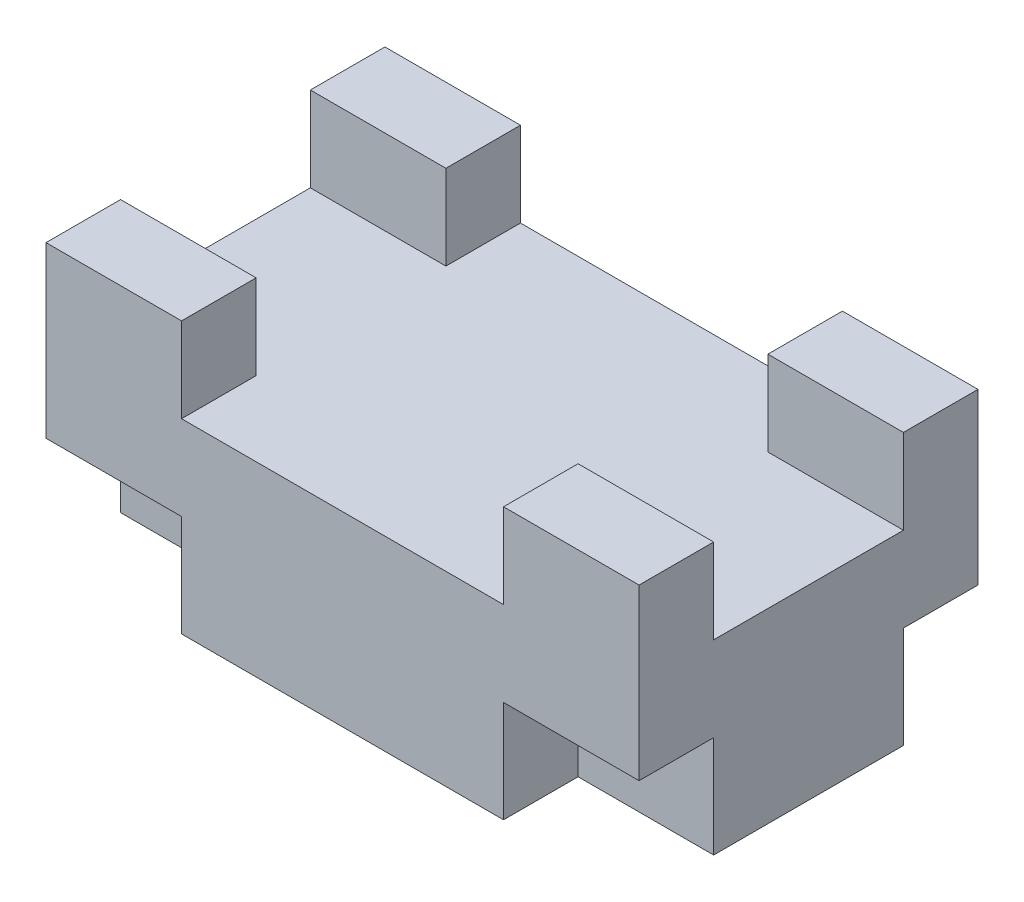
ISO-10303-21;
HEADER;
FILE_DESCRIPTION(('STEP AP214'),'2;1');
FILE_NAME('part.step','',(''),(''),'','','');
FILE_SCHEMA(('AUTOMOTIVE_DESIGN { 1 0 10303 214 1 1 1 1 }'));
ENDSEC;
DATA;
#1=APPLICATION_CONTEXT('core data for automotive mechanical design processes');
#2=APPLICATION_PROTOCOL_DEFINITION('international standard','automotive_design',2000,#1);
#3=PRODUCT_CONTEXT('',#1,'mechanical');
#4=PRODUCT('Part','Part','',(#3));
#5=PRODUCT_RELATED_PRODUCT_CATEGORY('part','',(#4));
#6=PRODUCT_DEFINITION_FORMATION('','',#4);
#7=PRODUCT_DEFINITION_CONTEXT('part definition',#1,'design');
#8=PRODUCT_DEFINITION('design','',#6,#7);
#9=PRODUCT_DEFINITION_SHAPE('','',#8);
#10=(LENGTH_UNIT() NAMED_UNIT(*) SI_UNIT(.MILLI.,.METRE.));
#11=(NAMED_UNIT(*) PLANE_ANGLE_UNIT() SI_UNIT($,.RADIAN.));
#12=(NAMED_UNIT(*) SI_UNIT($,.STERADIAN.) SOLID_ANGLE_UNIT());
#13=UNCERTAINTY_MEASURE_WITH_UNIT(LENGTH_MEASURE(1.E-05),#10,'distance_accuracy_value','');
#14=(GEOMETRIC_REPRESENTATION_CONTEXT(3) GLOBAL_UNCERTAINTY_ASSIGNED_CONTEXT((#13)) GLOBAL_UNIT_ASSIGNED_CONTEXT((#10,
#11,#12)) REPRESENTATION_CONTEXT('',''));
#15=CARTESIAN_POINT('',(0.,0.,0.));
#16=DIRECTION('',(0.,0.,1.));
#17=DIRECTION('',(1.,0.,0.));
#18=AXIS2_PLACEMENT_3D('',#15,#16,#17);
#19=CARTESIAN_POINT('',(0.,55.,0.));
#20=DIRECTION('',(0.,-1.,0.));
#21=DIRECTION('',(0.,0.,-1.));
#22=AXIS2_PLACEMENT_3D('',#19,#20,#21);
#23=PLANE('',#22);
#24=DIRECTION('',(-1.,0.,0.));
#25=VECTOR('',#24,1.);
#26=CARTESIAN_POINT('',(0.,55.,28.));
#27=LINE('',#26,#25);
#28=CARTESIAN_POINT('',(87.5,55.,28.));
#29=VERTEX_POINT('',#28);
#30=CARTESIAN_POINT('',(47.5,55.,28.));
#31=VERTEX_POINT('',#30);
#32=EDGE_CURVE('E61',#29,#31,#27,.T.);
#33=ORIENTED_EDGE('',*,*,#32,.F.);
#34=DIRECTION('',(0.,0.,1.));
#35=VECTOR('',#34,1.);
#36=CARTESIAN_POINT('',(87.5,55.,0.));
#37=LINE('',#36,#35);
#38=CARTESIAN_POINT('',(87.5,55.,-28.));
#39=VERTEX_POINT('',#38);
#40=EDGE_CURVE('E376',#39,#29,#37,.T.);
#41=ORIENTED_EDGE('',*,*,#40,.F.);
#42=DIRECTION('',(-1.,0.,0.));
#43=VECTOR('',#42,1.);
#44=CARTESIAN_POINT('',(0.,55.,-28.));
#45=LINE('',#44,#43);
#46=CARTESIAN_POINT('',(47.5,55.,-28.));
#47=VERTEX_POINT('',#46);
#48=EDGE_CURVE('E278',#39,#47,#45,.T.);
#49=ORIENTED_EDGE('',*,*,#48,.T.);
#50=DIRECTION('',(0.,0.,1.));
#51=VECTOR('',#50,1.);
#52=CARTESIAN_POINT('',(47.5,55.,0.));
#53=LINE('',#52,#51);
#54=CARTESIAN_POINT('',(47.5,55.,-50.));
#55=VERTEX_POINT('',#54);
#56=EDGE_CURVE('E290',#55,#47,#53,.T.);
#57=ORIENTED_EDGE('',*,*,#56,.F.);
#58=DIRECTION('',(-1.,0.,0.));
#59=VECTOR('',#58,1.);
#60=CARTESIAN_POINT('',(0.,55.,-50.));
#61=LINE('',#60,#59);
#62=CARTESIAN_POINT('',(-47.5,55.,-50.));
#63=VERTEX_POINT('',#62);
#64=EDGE_CURVE('E380',#55,#63,#61,.T.);
#65=ORIENTED_EDGE('',*,*,#64,.T.);
#66=DIRECTION('',(0.,0.,1.));
#67=VECTOR('',#66,1.);
#68=CARTESIAN_POINT('',(-47.5,55.,0.));
#69=LINE('',#68,#67);
#70=CARTESIAN_POINT('',(-47.5,55.,-28.));
#71=VERTEX_POINT('',#70);
#72=EDGE_CURVE('E243',#63,#71,#69,.T.);
#73=ORIENTED_EDGE('',*,*,#72,.T.);
#74=DIRECTION('',(1.,0.,0.));
#75=VECTOR('',#74,1.);
#76=CARTESIAN_POINT('',(0.,55.,-28.));
#77=LINE('',#76,#75);
#78=CARTESIAN_POINT('',(-87.5,55.,-28.));
#79=VERTEX_POINT('',#78);
#80=EDGE_CURVE('E69',#79,#71,#77,.T.);
#81=ORIENTED_EDGE('',*,*,#80,.F.);
#82=DIRECTION('',(0.,0.,1.));
#83=VECTOR('',#82,1.);
#84=CARTESIAN_POINT('',(-87.5,55.,0.));
#85=LINE('',#84,#83);
#86=CARTESIAN_POINT('',(-87.5,55.,28.));
#87=VERTEX_POINT('',#86);
#88=EDGE_CURVE('E368',#79,#87,#85,.T.);
#89=ORIENTED_EDGE('',*,*,#88,.T.);
#90=DIRECTION('',(1.,0.,0.));
#91=VECTOR('',#90,1.);
#92=CARTESIAN_POINT('',(0.,55.,28.));
#93=LINE('',#92,#91);
#94=CARTESIAN_POINT('',(-47.5,55.,28.));
#95=VERTEX_POINT('',#94);
#96=EDGE_CURVE('E251',#87,#95,#93,.T.);
#97=ORIENTED_EDGE('',*,*,#96,.T.);
#98=DIRECTION('',(0.,0.,-1.));
#99=VECTOR('',#98,1.);
#100=CARTESIAN_POINT('',(-47.5,55.,0.));
#101=LINE('',#100,#99);
#102=CARTESIAN_POINT('',(-47.5,55.,50.));
#103=VERTEX_POINT('',#102);
#104=EDGE_CURVE('E340',#103,#95,#101,.T.);
#105=ORIENTED_EDGE('',*,*,#104,.F.);
#106=DIRECTION('',(-1.,0.,0.));
#107=VECTOR('',#106,1.);
#108=CARTESIAN_POINT('',(0.,55.,50.));
#109=LINE('',#108,#107);
#110=CARTESIAN_POINT('',(47.5,55.,50.));
#111=VERTEX_POINT('',#110);
#112=EDGE_CURVE('E371',#111,#103,#109,.T.);
#113=ORIENTED_EDGE('',*,*,#112,.F.);
#114=DIRECTION('',(0.,0.,-1.));
#115=VECTOR('',#114,1.);
#116=CARTESIAN_POINT('',(47.5,55.,0.));
#117=LINE('',#116,#115);
#118=EDGE_CURVE('E311',#111,#31,#117,.T.);
#119=ORIENTED_EDGE('',*,*,#118,.T.);
#120=EDGE_LOOP('',(#33,#41,#49,#57,#65,#73,#81,#89,#97,#105,#113,#119));
#121=FACE_BOUND('',#120,.T.);
#122=ADVANCED_FACE('F45',(#121),#23,.F.);
#123=CARTESIAN_POINT('',(0.,30.,50.));
#124=DIRECTION('',(0.,0.,-1.));
#125=DIRECTION('',(-1.,0.,0.));
#126=AXIS2_PLACEMENT_3D('',#123,#124,#125);
#127=PLANE('',#126);
#128=DIRECTION('',(1.,0.,0.));
#129=VECTOR('',#128,1.);
#130=CARTESIAN_POINT('',(0.,0.,50.));
#131=LINE('',#130,#129);
#132=CARTESIAN_POINT('',(-47.5,0.,50.));
#133=VERTEX_POINT('',#132);
#134=CARTESIAN_POINT('',(47.5,0.,50.));
#135=VERTEX_POINT('',#134);
#136=EDGE_CURVE('E415',#133,#135,#131,.T.);
#137=ORIENTED_EDGE('',*,*,#136,.T.);
#138=DIRECTION('',(0.,-1.,0.));
#139=VECTOR('',#138,1.);
#140=CARTESIAN_POINT('',(47.5,30.,50.));
#141=LINE('',#140,#139);
#142=CARTESIAN_POINT('',(47.5,30.,50.));
#143=VERTEX_POINT('',#142);
#144=EDGE_CURVE('E11',#143,#135,#141,.T.);
#145=ORIENTED_EDGE('',*,*,#144,.F.);
#146=DIRECTION('',(-1.,0.,0.));
#147=VECTOR('',#146,1.);
#148=CARTESIAN_POINT('',(0.,30.,50.));
#149=LINE('',#148,#147);
#150=CARTESIAN_POINT('',(87.5,30.,50.));
#151=VERTEX_POINT('',#150);
#152=EDGE_CURVE('E390',#151,#143,#149,.T.);
#153=ORIENTED_EDGE('',*,*,#152,.F.);
#154=DIRECTION('',(0.,-1.,0.));
#155=VECTOR('',#154,1.);
#156=CARTESIAN_POINT('',(87.5,55.,50.));
#157=LINE('',#156,#155);
#158=CARTESIAN_POINT('',(87.5,80.,50.));
#159=VERTEX_POINT('',#158);
#160=EDGE_CURVE('E407',#159,#151,#157,.T.);
#161=ORIENTED_EDGE('',*,*,#160,.F.);
#162=DIRECTION('',(1.,0.,0.));
#163=VECTOR('',#162,1.);
#164=CARTESIAN_POINT('',(0.,80.,50.));
#165=LINE('',#164,#163);
#166=CARTESIAN_POINT('',(47.5,80.,50.));
#167=VERTEX_POINT('',#166);
#168=EDGE_CURVE('E315',#167,#159,#165,.T.);
#169=ORIENTED_EDGE('',*,*,#168,.F.);
#170=DIRECTION('',(0.,-1.,0.));
#171=VECTOR('',#170,1.);
#172=CARTESIAN_POINT('',(47.5,80.,50.));
#173=LINE('',#172,#171);
#174=EDGE_CURVE('E330',#167,#111,#173,.T.);
#175=ORIENTED_EDGE('',*,*,#174,.T.);
#176=ORIENTED_EDGE('',*,*,#112,.T.);
#177=DIRECTION('',(0.,-1.,0.));
#178=VECTOR('',#177,1.);
#179=CARTESIAN_POINT('',(-47.5,80.,50.));
#180=LINE('',#179,#178);
#181=CARTESIAN_POINT('',(-47.5,80.,50.));
#182=VERTEX_POINT('',#181);
#183=EDGE_CURVE('E356',#182,#103,#180,.T.);
#184=ORIENTED_EDGE('',*,*,#183,.F.);
#185=DIRECTION('',(1.,0.,0.));
#186=VECTOR('',#185,1.);
#187=CARTESIAN_POINT('',(0.,80.,50.));
#188=LINE('',#187,#186);
#189=CARTESIAN_POINT('',(-87.5,80.,50.));
#190=VERTEX_POINT('',#189);
#191=EDGE_CURVE('E347',#190,#182,#188,.T.);
#192=ORIENTED_EDGE('',*,*,#191,.F.);
#193=DIRECTION('',(0.,-1.,0.));
#194=VECTOR('',#193,1.);
#195=CARTESIAN_POINT('',(-87.5,55.,50.));
#196=LINE('',#195,#194);
#197=CARTESIAN_POINT('',(-87.5,30.,50.));
#198=VERTEX_POINT('',#197);
#199=EDGE_CURVE('E411',#190,#198,#196,.T.);
#200=ORIENTED_EDGE('',*,*,#199,.T.);
#201=CARTESIAN_POINT('',(-47.5,30.,50.));
#202=VERTEX_POINT('',#201);
#203=EDGE_CURVE('E389',#202,#198,#149,.T.);
#204=ORIENTED_EDGE('',*,*,#203,.F.);
#205=DIRECTION('',(0.,-1.,0.));
#206=VECTOR('',#205,1.);
#207=CARTESIAN_POINT('',(-47.5,30.,50.));
#208=LINE('',#207,#206);
#209=EDGE_CURVE('E445',#202,#133,#208,.T.);
#210=ORIENTED_EDGE('',*,*,#209,.T.);
#211=EDGE_LOOP('',(#137,#145,#153,#161,#169,#175,#176,#184,#192,#200,#204,#210));
#212=FACE_BOUND('',#211,.T.);
#213=ADVANCED_FACE('F47',(#212),#127,.F.);
#214=CARTESIAN_POINT('',(47.5,30.,0.));
#215=DIRECTION('',(-1.,0.,0.));
#216=DIRECTION('',(0.,0.,1.));
#217=AXIS2_PLACEMENT_3D('',#214,#215,#216);
#218=PLANE('',#217);
#219=DIRECTION('',(0.,0.,-1.));
#220=VECTOR('',#219,1.);
#221=CARTESIAN_POINT('',(47.5,0.,0.));
#222=LINE('',#221,#220);
#223=CARTESIAN_POINT('',(47.5,0.,28.));
#224=VERTEX_POINT('',#223);
#225=EDGE_CURVE('E449',#135,#224,#222,.T.);
#226=ORIENTED_EDGE('',*,*,#225,.T.);
#227=DIRECTION('',(0.,-1.,0.));
#228=VECTOR('',#227,1.);
#229=CARTESIAN_POINT('',(47.5,30.,28.));
#230=LINE('',#229,#228);
#231=CARTESIAN_POINT('',(47.5,30.,28.));
#232=VERTEX_POINT('',#231);
#233=EDGE_CURVE('E54',#232,#224,#230,.T.);
#234=ORIENTED_EDGE('',*,*,#233,.F.);
#235=DIRECTION('',(0.,0.,-1.));
#236=VECTOR('',#235,1.);
#237=CARTESIAN_POINT('',(47.5,30.,0.));
#238=LINE('',#237,#236);
#239=EDGE_CURVE('E416',#143,#232,#238,.T.);
#240=ORIENTED_EDGE('',*,*,#239,.F.);
#241=ORIENTED_EDGE('',*,*,#144,.T.);
#242=EDGE_LOOP('',(#226,#234,#240,#241));
#243=FACE_BOUND('',#242,.T.);
#244=ADVANCED_FACE('F528',(#243),#218,.F.);
#245=CARTESIAN_POINT('',(0.,30.,28.));
#246=DIRECTION('',(0.,0.,1.));
#247=DIRECTION('',(1.,0.,0.));
#248=AXIS2_PLACEMENT_3D('',#245,#246,#247);
#249=PLANE('',#248);
#250=DIRECTION('',(-1.,0.,0.));
#251=VECTOR('',#250,1.);
#252=CARTESIAN_POINT('',(0.,0.,28.));
#253=LINE('',#252,#251);
#254=CARTESIAN_POINT('',(87.5,0.,28.));
#255=VERTEX_POINT('',#254);
#256=EDGE_CURVE('E453',#255,#224,#253,.T.);
#257=ORIENTED_EDGE('',*,*,#256,.F.);
#258=DIRECTION('',(0.,-1.,0.));
#259=VECTOR('',#258,1.);
#260=CARTESIAN_POINT('',(87.5,30.,28.));
#261=LINE('',#260,#259);
#262=CARTESIAN_POINT('',(87.5,30.,28.));
#263=VERTEX_POINT('',#262);
#264=EDGE_CURVE('E518',#263,#255,#261,.T.);
#265=ORIENTED_EDGE('',*,*,#264,.F.);
#266=DIRECTION('',(-1.,0.,0.));
#267=VECTOR('',#266,1.);
#268=CARTESIAN_POINT('',(0.,30.,28.));
#269=LINE('',#268,#267);
#270=EDGE_CURVE('E419',#263,#232,#269,.T.);
#271=ORIENTED_EDGE('',*,*,#270,.T.);
#272=ORIENTED_EDGE('',*,*,#233,.T.);
#273=EDGE_LOOP('',(#257,#265,#271,#272));
#274=FACE_BOUND('',#273,.T.);
#275=ADVANCED_FACE('F524',(#274),#249,.T.);
#276=CARTESIAN_POINT('',(87.5,30.,0.));
#277=DIRECTION('',(-1.,0.,0.));
#278=DIRECTION('',(0.,0.,1.));
#279=AXIS2_PLACEMENT_3D('',#276,#277,#278);
#280=PLANE('',#279);
#281=DIRECTION('',(0.,0.,-1.));
#282=VECTOR('',#281,1.);
#283=CARTESIAN_POINT('',(87.5,0.,0.));
#284=LINE('',#283,#282);
#285=CARTESIAN_POINT('',(87.5,0.,-28.));
#286=VERTEX_POINT('',#285);
#287=EDGE_CURVE('E457',#255,#286,#284,.T.);
#288=ORIENTED_EDGE('',*,*,#287,.T.);
#289=DIRECTION('',(0.,-1.,0.));
#290=VECTOR('',#289,1.);
#291=CARTESIAN_POINT('',(87.5,30.,-28.));
#292=LINE('',#291,#290);
#293=CARTESIAN_POINT('',(87.5,30.,-28.));
#294=VERTEX_POINT('',#293);
#295=EDGE_CURVE('E514',#294,#286,#292,.T.);
#296=ORIENTED_EDGE('',*,*,#295,.F.);
#297=DIRECTION('',(0.,0.,1.));
#298=VECTOR('',#297,1.);
#299=CARTESIAN_POINT('',(87.5,30.,0.));
#300=LINE('',#299,#298);
#301=CARTESIAN_POINT('',(87.5,30.,-50.));
#302=VERTEX_POINT('',#301);
#303=EDGE_CURVE('E394',#302,#294,#300,.T.);
#304=ORIENTED_EDGE('',*,*,#303,.F.);
#305=DIRECTION('',(0.,-1.,0.));
#306=VECTOR('',#305,1.);
#307=CARTESIAN_POINT('',(87.5,55.,-50.));
#308=LINE('',#307,#306);
#309=CARTESIAN_POINT('',(87.5,80.,-50.));
#310=VERTEX_POINT('',#309);
#311=EDGE_CURVE('E404',#310,#302,#308,.T.);
#312=ORIENTED_EDGE('',*,*,#311,.F.);
#313=DIRECTION('',(0.,0.,-1.));
#314=VECTOR('',#313,1.);
#315=CARTESIAN_POINT('',(87.5,80.,0.));
#316=LINE('',#315,#314);
#317=CARTESIAN_POINT('',(87.5,80.,-28.));
#318=VERTEX_POINT('',#317);
#319=EDGE_CURVE('E273',#318,#310,#316,.T.);
#320=ORIENTED_EDGE('',*,*,#319,.F.);
#321=DIRECTION('',(0.,-1.,0.));
#322=VECTOR('',#321,1.);
#323=CARTESIAN_POINT('',(87.5,80.,-28.));
#324=LINE('',#323,#322);
#325=EDGE_CURVE('E289',#318,#39,#324,.T.);
#326=ORIENTED_EDGE('',*,*,#325,.T.);
#327=ORIENTED_EDGE('',*,*,#40,.T.);
#328=DIRECTION('',(0.,-1.,0.));
#329=VECTOR('',#328,1.);
#330=CARTESIAN_POINT('',(87.5,80.,28.));
#331=LINE('',#330,#329);
#332=CARTESIAN_POINT('',(87.5,80.,28.));
#333=VERTEX_POINT('',#332);
#334=EDGE_CURVE('E322',#333,#29,#331,.T.);
#335=ORIENTED_EDGE('',*,*,#334,.F.);
#336=DIRECTION('',(0.,0.,-1.));
#337=VECTOR('',#336,1.);
#338=CARTESIAN_POINT('',(87.5,80.,0.));
#339=LINE('',#338,#337);
#340=EDGE_CURVE('E319',#159,#333,#339,.T.);
#341=ORIENTED_EDGE('',*,*,#340,.F.);
#342=ORIENTED_EDGE('',*,*,#160,.T.);
#343=EDGE_CURVE('E393',#263,#151,#300,.T.);
#344=ORIENTED_EDGE('',*,*,#343,.F.);
#345=ORIENTED_EDGE('',*,*,#264,.T.);
#346=EDGE_LOOP('',(#288,#296,#304,#312,#320,#326,#327,#335,#341,#342,#344,#345));
#347=FACE_BOUND('',#346,.T.);
#348=ADVANCED_FACE('F537',(#347),#280,.F.);
#349=CARTESIAN_POINT('',(0.,30.,-28.));
#350=DIRECTION('',(0.,0.,1.));
#351=DIRECTION('',(1.,0.,0.));
#352=AXIS2_PLACEMENT_3D('',#349,#350,#351);
#353=PLANE('',#352);
#354=DIRECTION('',(-1.,0.,0.));
#355=VECTOR('',#354,1.);
#356=CARTESIAN_POINT('',(0.,0.,-28.));
#357=LINE('',#356,#355);
#358=CARTESIAN_POINT('',(47.5,0.,-28.));
#359=VERTEX_POINT('',#358);
#360=EDGE_CURVE('E460',#286,#359,#357,.T.);
#361=ORIENTED_EDGE('',*,*,#360,.T.);
#362=DIRECTION('',(0.,-1.,0.));
#363=VECTOR('',#362,1.);
#364=CARTESIAN_POINT('',(47.5,30.,-28.));
#365=LINE('',#364,#363);
#366=CARTESIAN_POINT('',(47.5,30.,-28.));
#367=VERTEX_POINT('',#366);
#368=EDGE_CURVE('E511',#367,#359,#365,.T.);
#369=ORIENTED_EDGE('',*,*,#368,.F.);
#370=DIRECTION('',(-1.,0.,0.));
#371=VECTOR('',#370,1.);
#372=CARTESIAN_POINT('',(0.,30.,-28.));
#373=LINE('',#372,#371);
#374=EDGE_CURVE('E424',#294,#367,#373,.T.);
#375=ORIENTED_EDGE('',*,*,#374,.F.);
#376=ORIENTED_EDGE('',*,*,#295,.T.);
#377=EDGE_LOOP('',(#361,#369,#375,#376));
#378=FACE_BOUND('',#377,.T.);
#379=ADVANCED_FACE('F542',(#378),#353,.F.);
#380=CARTESIAN_POINT('',(47.5,30.,0.));
#381=DIRECTION('',(1.,0.,0.));
#382=DIRECTION('',(0.,0.,-1.));
#383=AXIS2_PLACEMENT_3D('',#380,#381,#382);
#384=PLANE('',#383);
#385=DIRECTION('',(0.,0.,1.));
#386=VECTOR('',#385,1.);
#387=CARTESIAN_POINT('',(47.5,0.,0.));
#388=LINE('',#387,#386);
#389=CARTESIAN_POINT('',(47.5,0.,-50.));
#390=VERTEX_POINT('',#389);
#391=EDGE_CURVE('E464',#390,#359,#388,.T.);
#392=ORIENTED_EDGE('',*,*,#391,.F.);
#393=DIRECTION('',(0.,-1.,0.));
#394=VECTOR('',#393,1.);
#395=CARTESIAN_POINT('',(47.5,30.,-50.));
#396=LINE('',#395,#394);
#397=CARTESIAN_POINT('',(47.5,30.,-50.));
#398=VERTEX_POINT('',#397);
#399=EDGE_CURVE('E508',#398,#390,#396,.T.);
#400=ORIENTED_EDGE('',*,*,#399,.F.);
#401=DIRECTION('',(0.,0.,1.));
#402=VECTOR('',#401,1.);
#403=CARTESIAN_POINT('',(47.5,30.,0.));
#404=LINE('',#403,#402);
#405=EDGE_CURVE('E427',#398,#367,#404,.T.);
#406=ORIENTED_EDGE('',*,*,#405,.T.);
#407=ORIENTED_EDGE('',*,*,#368,.T.);
#408=EDGE_LOOP('',(#392,#400,#406,#407));
#409=FACE_BOUND('',#408,.T.);
#410=ADVANCED_FACE('F646',(#409),#384,.T.);
#411=CARTESIAN_POINT('',(0.,30.,-50.));
#412=DIRECTION('',(0.,0.,-1.));
#413=DIRECTION('',(-1.,0.,0.));
#414=AXIS2_PLACEMENT_3D('',#411,#412,#413);
#415=PLANE('',#414);
#416=DIRECTION('',(1.,0.,0.));
#417=VECTOR('',#416,1.);
#418=CARTESIAN_POINT('',(0.,0.,-50.));
#419=LINE('',#418,#417);
#420=CARTESIAN_POINT('',(-47.5,0.,-50.));
#421=VERTEX_POINT('',#420);
#422=EDGE_CURVE('E468',#421,#390,#419,.T.);
#423=ORIENTED_EDGE('',*,*,#422,.F.);
#424=DIRECTION('',(0.,-1.,0.));
#425=VECTOR('',#424,1.);
#426=CARTESIAN_POINT('',(-47.5,30.,-50.));
#427=LINE('',#426,#425);
#428=CARTESIAN_POINT('',(-47.5,30.,-50.));
#429=VERTEX_POINT('',#428);
#430=EDGE_CURVE('E505',#429,#421,#427,.T.);
#431=ORIENTED_EDGE('',*,*,#430,.F.);
#432=DIRECTION('',(-1.,0.,0.));
#433=VECTOR('',#432,1.);
#434=CARTESIAN_POINT('',(0.,30.,-50.));
#435=LINE('',#434,#433);
#436=CARTESIAN_POINT('',(-87.5,30.,-50.));
#437=VERTEX_POINT('',#436);
#438=EDGE_CURVE('E397',#429,#437,#435,.T.);
#439=ORIENTED_EDGE('',*,*,#438,.T.);
#440=DIRECTION('',(0.,-1.,0.));
#441=VECTOR('',#440,1.);
#442=CARTESIAN_POINT('',(-87.5,55.,-50.));
#443=LINE('',#442,#441);
#444=CARTESIAN_POINT('',(-87.5,80.,-50.));
#445=VERTEX_POINT('',#444);
#446=EDGE_CURVE('E384',#445,#437,#443,.T.);
#447=ORIENTED_EDGE('',*,*,#446,.F.);
#448=DIRECTION('',(1.,0.,0.));
#449=VECTOR('',#448,1.);
#450=CARTESIAN_POINT('',(0.,80.,-50.));
#451=LINE('',#450,#449);
#452=CARTESIAN_POINT('',(-47.5,80.,-50.));
#453=VERTEX_POINT('',#452);
#454=EDGE_CURVE('E256',#445,#453,#451,.T.);
#455=ORIENTED_EDGE('',*,*,#454,.T.);
#456=DIRECTION('',(0.,-1.,0.));
#457=VECTOR('',#456,1.);
#458=CARTESIAN_POINT('',(-47.5,80.,-50.));
#459=LINE('',#458,#457);
#460=EDGE_CURVE('E252',#453,#63,#459,.T.);
#461=ORIENTED_EDGE('',*,*,#460,.T.);
#462=ORIENTED_EDGE('',*,*,#64,.F.);
#463=DIRECTION('',(0.,-1.,0.));
#464=VECTOR('',#463,1.);
#465=CARTESIAN_POINT('',(47.5,80.,-50.));
#466=LINE('',#465,#464);
#467=CARTESIAN_POINT('',(47.5,80.,-50.));
#468=VERTEX_POINT('',#467);
#469=EDGE_CURVE('E266',#468,#55,#466,.T.);
#470=ORIENTED_EDGE('',*,*,#469,.F.);
#471=DIRECTION('',(1.,0.,0.));
#472=VECTOR('',#471,1.);
#473=CARTESIAN_POINT('',(0.,80.,-50.));
#474=LINE('',#473,#472);
#475=EDGE_CURVE('E277',#468,#310,#474,.T.);
#476=ORIENTED_EDGE('',*,*,#475,.T.);
#477=ORIENTED_EDGE('',*,*,#311,.T.);
#478=EDGE_CURVE('E372',#302,#398,#435,.T.);
#479=ORIENTED_EDGE('',*,*,#478,.T.);
#480=ORIENTED_EDGE('',*,*,#399,.T.);
#481=EDGE_LOOP('',(#423,#431,#439,#447,#455,#461,#462,#470,#476,#477,#479,#480));
#482=FACE_BOUND('',#481,.T.);
#483=ADVANCED_FACE('F554',(#482),#415,.T.);
#484=CARTESIAN_POINT('',(-47.5,30.,0.));
#485=DIRECTION('',(1.,0.,0.));
#486=DIRECTION('',(0.,0.,-1.));
#487=AXIS2_PLACEMENT_3D('',#484,#485,#486);
#488=PLANE('',#487);
#489=DIRECTION('',(0.,0.,1.));
#490=VECTOR('',#489,1.);
#491=CARTESIAN_POINT('',(-47.5,0.,0.));
#492=LINE('',#491,#490);
#493=CARTESIAN_POINT('',(-47.5,0.,-28.));
#494=VERTEX_POINT('',#493);
#495=EDGE_CURVE('E472',#421,#494,#492,.T.);
#496=ORIENTED_EDGE('',*,*,#495,.T.);
#497=DIRECTION('',(0.,-1.,0.));
#498=VECTOR('',#497,1.);
#499=CARTESIAN_POINT('',(-47.5,30.,-28.));
#500=LINE('',#499,#498);
#501=CARTESIAN_POINT('',(-47.5,30.,-28.));
#502=VERTEX_POINT('',#501);
#503=EDGE_CURVE('E502',#502,#494,#500,.T.);
#504=ORIENTED_EDGE('',*,*,#503,.F.);
#505=DIRECTION('',(0.,0.,1.));
#506=VECTOR('',#505,1.);
#507=CARTESIAN_POINT('',(-47.5,30.,0.));
#508=LINE('',#507,#506);
#509=EDGE_CURVE('E431',#429,#502,#508,.T.);
#510=ORIENTED_EDGE('',*,*,#509,.F.);
#511=ORIENTED_EDGE('',*,*,#430,.T.);
#512=EDGE_LOOP('',(#496,#504,#510,#511));
#513=FACE_BOUND('',#512,.T.);
#514=ADVANCED_FACE('F639',(#513),#488,.F.);
#515=CARTESIAN_POINT('',(0.,30.,-28.));
#516=DIRECTION('',(0.,0.,-1.));
#517=DIRECTION('',(-1.,0.,0.));
#518=AXIS2_PLACEMENT_3D('',#515,#516,#517);
#519=PLANE('',#518);
#520=DIRECTION('',(1.,0.,0.));
#521=VECTOR('',#520,1.);
#522=CARTESIAN_POINT('',(0.,0.,-28.));
#523=LINE('',#522,#521);
#524=CARTESIAN_POINT('',(-87.5,0.,-28.));
#525=VERTEX_POINT('',#524);
#526=EDGE_CURVE('E476',#525,#494,#523,.T.);
#527=ORIENTED_EDGE('',*,*,#526,.F.);
#528=DIRECTION('',(0.,-1.,0.));
#529=VECTOR('',#528,1.);
#530=CARTESIAN_POINT('',(-87.5,30.,-28.));
#531=LINE('',#530,#529);
#532=CARTESIAN_POINT('',(-87.5,30.,-28.));
#533=VERTEX_POINT('',#532);
#534=EDGE_CURVE('E499',#533,#525,#531,.T.);
#535=ORIENTED_EDGE('',*,*,#534,.F.);
#536=DIRECTION('',(1.,0.,0.));
#537=VECTOR('',#536,1.);
#538=CARTESIAN_POINT('',(0.,30.,-28.));
#539=LINE('',#538,#537);
#540=EDGE_CURVE('E434',#533,#502,#539,.T.);
#541=ORIENTED_EDGE('',*,*,#540,.T.);
#542=ORIENTED_EDGE('',*,*,#503,.T.);
#543=EDGE_LOOP('',(#527,#535,#541,#542));
#544=FACE_BOUND('',#543,.T.);
#545=ADVANCED_FACE('F636',(#544),#519,.T.);
#546=CARTESIAN_POINT('',(-87.5,30.,0.));
#547=DIRECTION('',(-1.,0.,0.));
#548=DIRECTION('',(0.,0.,1.));
#549=AXIS2_PLACEMENT_3D('',#546,#547,#548);
#550=PLANE('',#549);
#551=DIRECTION('',(0.,0.,-1.));
#552=VECTOR('',#551,1.);
#553=CARTESIAN_POINT('',(-87.5,0.,0.));
#554=LINE('',#553,#552);
#555=CARTESIAN_POINT('',(-87.5,0.,28.));
#556=VERTEX_POINT('',#555);
#557=EDGE_CURVE('E480',#556,#525,#554,.T.);
#558=ORIENTED_EDGE('',*,*,#557,.F.);
#559=DIRECTION('',(0.,-1.,0.));
#560=VECTOR('',#559,1.);
#561=CARTESIAN_POINT('',(-87.5,30.,28.));
#562=LINE('',#561,#560);
#563=CARTESIAN_POINT('',(-87.5,30.,28.));
#564=VERTEX_POINT('',#563);
#565=EDGE_CURVE('E496',#564,#556,#562,.T.);
#566=ORIENTED_EDGE('',*,*,#565,.F.);
#567=DIRECTION('',(0.,0.,1.));
#568=VECTOR('',#567,1.);
#569=CARTESIAN_POINT('',(-87.5,30.,0.));
#570=LINE('',#569,#568);
#571=EDGE_CURVE('E360',#564,#198,#570,.T.);
#572=ORIENTED_EDGE('',*,*,#571,.T.);
#573=ORIENTED_EDGE('',*,*,#199,.F.);
#574=DIRECTION('',(0.,0.,-1.));
#575=VECTOR('',#574,1.);
#576=CARTESIAN_POINT('',(-87.5,80.,0.));
#577=LINE('',#576,#575);
#578=CARTESIAN_POINT('',(-87.5,80.,28.));
#579=VERTEX_POINT('',#578);
#580=EDGE_CURVE('E335',#190,#579,#577,.T.);
#581=ORIENTED_EDGE('',*,*,#580,.T.);
#582=DIRECTION('',(0.,-1.,0.));
#583=VECTOR('',#582,1.);
#584=CARTESIAN_POINT('',(-87.5,80.,28.));
#585=LINE('',#584,#583);
#586=EDGE_CURVE('E350',#579,#87,#585,.T.);
#587=ORIENTED_EDGE('',*,*,#586,.T.);
#588=ORIENTED_EDGE('',*,*,#88,.F.);
#589=DIRECTION('',(0.,-1.,0.));
#590=VECTOR('',#589,1.);
#591=CARTESIAN_POINT('',(-87.5,80.,-28.));
#592=LINE('',#591,#590);
#593=CARTESIAN_POINT('',(-87.5,80.,-28.));
#594=VERTEX_POINT('',#593);
#595=EDGE_CURVE('E263',#594,#79,#592,.T.);
#596=ORIENTED_EDGE('',*,*,#595,.F.);
#597=DIRECTION('',(0.,0.,-1.));
#598=VECTOR('',#597,1.);
#599=CARTESIAN_POINT('',(-87.5,80.,0.));
#600=LINE('',#599,#598);
#601=EDGE_CURVE('E241',#594,#445,#600,.T.);
#602=ORIENTED_EDGE('',*,*,#601,.T.);
#603=ORIENTED_EDGE('',*,*,#446,.T.);
#604=EDGE_CURVE('E385',#437,#533,#570,.T.);
#605=ORIENTED_EDGE('',*,*,#604,.T.);
#606=ORIENTED_EDGE('',*,*,#534,.T.);
#607=EDGE_LOOP('',(#558,#566,#572,#573,#581,#587,#588,#596,#602,#603,#605,#606));
#608=FACE_BOUND('',#607,.T.);
#609=ADVANCED_FACE('F588',(#608),#550,.T.);
#610=CARTESIAN_POINT('',(0.,30.,28.));
#611=DIRECTION('',(0.,0.,-1.));
#612=DIRECTION('',(-1.,0.,0.));
#613=AXIS2_PLACEMENT_3D('',#610,#611,#612);
#614=PLANE('',#613);
#615=DIRECTION('',(1.,0.,0.));
#616=VECTOR('',#615,1.);
#617=CARTESIAN_POINT('',(0.,0.,28.));
#618=LINE('',#617,#616);
#619=CARTESIAN_POINT('',(-47.5,0.,28.));
#620=VERTEX_POINT('',#619);
#621=EDGE_CURVE('E484',#556,#620,#618,.T.);
#622=ORIENTED_EDGE('',*,*,#621,.T.);
#623=DIRECTION('',(0.,-1.,0.));
#624=VECTOR('',#623,1.);
#625=CARTESIAN_POINT('',(-47.5,30.,28.));
#626=LINE('',#625,#624);
#627=CARTESIAN_POINT('',(-47.5,30.,28.));
#628=VERTEX_POINT('',#627);
#629=EDGE_CURVE('E493',#628,#620,#626,.T.);
#630=ORIENTED_EDGE('',*,*,#629,.F.);
#631=DIRECTION('',(1.,0.,0.));
#632=VECTOR('',#631,1.);
#633=CARTESIAN_POINT('',(0.,30.,28.));
#634=LINE('',#633,#632);
#635=EDGE_CURVE('E438',#564,#628,#634,.T.);
#636=ORIENTED_EDGE('',*,*,#635,.F.);
#637=ORIENTED_EDGE('',*,*,#565,.T.);
#638=EDGE_LOOP('',(#622,#630,#636,#637));
#639=FACE_BOUND('',#638,.T.);
#640=ADVANCED_FACE('F630',(#639),#614,.F.);
#641=CARTESIAN_POINT('',(-47.5,30.,0.));
#642=DIRECTION('',(-1.,0.,0.));
#643=DIRECTION('',(0.,0.,1.));
#644=AXIS2_PLACEMENT_3D('',#641,#642,#643);
#645=PLANE('',#644);
#646=DIRECTION('',(0.,0.,-1.));
#647=VECTOR('',#646,1.);
#648=CARTESIAN_POINT('',(-47.5,0.,0.));
#649=LINE('',#648,#647);
#650=EDGE_CURVE('E420',#133,#620,#649,.T.);
#651=ORIENTED_EDGE('',*,*,#650,.F.);
#652=ORIENTED_EDGE('',*,*,#209,.F.);
#653=DIRECTION('',(0.,0.,-1.));
#654=VECTOR('',#653,1.);
#655=CARTESIAN_POINT('',(-47.5,30.,0.));
#656=LINE('',#655,#654);
#657=EDGE_CURVE('E441',#202,#628,#656,.T.);
#658=ORIENTED_EDGE('',*,*,#657,.T.);
#659=ORIENTED_EDGE('',*,*,#629,.T.);
#660=EDGE_LOOP('',(#651,#652,#658,#659));
#661=FACE_BOUND('',#660,.T.);
#662=ADVANCED_FACE('F627',(#661),#645,.T.);
#663=CARTESIAN_POINT('',(0.,0.,0.));
#664=DIRECTION('',(0.,1.,0.));
#665=DIRECTION('',(0.,0.,1.));
#666=AXIS2_PLACEMENT_3D('',#663,#664,#665);
#667=PLANE('',#666);
#668=ORIENTED_EDGE('',*,*,#136,.F.);
#669=ORIENTED_EDGE('',*,*,#650,.T.);
#670=ORIENTED_EDGE('',*,*,#621,.F.);
#671=ORIENTED_EDGE('',*,*,#557,.T.);
#672=ORIENTED_EDGE('',*,*,#526,.T.);
#673=ORIENTED_EDGE('',*,*,#495,.F.);
#674=ORIENTED_EDGE('',*,*,#422,.T.);
#675=ORIENTED_EDGE('',*,*,#391,.T.);
#676=ORIENTED_EDGE('',*,*,#360,.F.);
#677=ORIENTED_EDGE('',*,*,#287,.F.);
#678=ORIENTED_EDGE('',*,*,#256,.T.);
#679=ORIENTED_EDGE('',*,*,#225,.F.);
#680=EDGE_LOOP('',(#668,#669,#670,#671,#672,#673,#674,#675,#676,#677,#678,#679));
#681=FACE_BOUND('',#680,.T.);
#682=ADVANCED_FACE('F533',(#681),#667,.F.);
#683=CARTESIAN_POINT('',(0.,30.,0.));
#684=DIRECTION('',(0.,-1.,0.));
#685=DIRECTION('',(0.,0.,-1.));
#686=AXIS2_PLACEMENT_3D('',#683,#684,#685);
#687=PLANE('',#686);
#688=ORIENTED_EDGE('',*,*,#152,.T.);
#689=ORIENTED_EDGE('',*,*,#239,.T.);
#690=ORIENTED_EDGE('',*,*,#270,.F.);
#691=ORIENTED_EDGE('',*,*,#343,.T.);
#692=EDGE_LOOP('',(#688,#689,#690,#691));
#693=FACE_BOUND('',#692,.T.);
#694=ADVANCED_FACE('F579',(#693),#687,.T.);
#695=ORIENTED_EDGE('',*,*,#303,.T.);
#696=ORIENTED_EDGE('',*,*,#374,.T.);
#697=ORIENTED_EDGE('',*,*,#405,.F.);
#698=ORIENTED_EDGE('',*,*,#478,.F.);
#699=EDGE_LOOP('',(#695,#696,#697,#698));
#700=FACE_BOUND('',#699,.T.);
#701=ADVANCED_FACE('F545',(#700),#687,.T.);
#702=ORIENTED_EDGE('',*,*,#438,.F.);
#703=ORIENTED_EDGE('',*,*,#509,.T.);
#704=ORIENTED_EDGE('',*,*,#540,.F.);
#705=ORIENTED_EDGE('',*,*,#604,.F.);
#706=EDGE_LOOP('',(#702,#703,#704,#705));
#707=FACE_BOUND('',#706,.T.);
#708=ADVANCED_FACE('F616',(#707),#687,.T.);
#709=ORIENTED_EDGE('',*,*,#571,.F.);
#710=ORIENTED_EDGE('',*,*,#635,.T.);
#711=ORIENTED_EDGE('',*,*,#657,.F.);
#712=ORIENTED_EDGE('',*,*,#203,.T.);
#713=EDGE_LOOP('',(#709,#710,#711,#712));
#714=FACE_BOUND('',#713,.T.);
#715=ADVANCED_FACE('F608',(#714),#687,.T.);
#716=CARTESIAN_POINT('',(-47.5,80.,0.));
#717=DIRECTION('',(-1.,0.,0.));
#718=DIRECTION('',(0.,0.,1.));
#719=AXIS2_PLACEMENT_3D('',#716,#717,#718);
#720=PLANE('',#719);
#721=ORIENTED_EDGE('',*,*,#104,.T.);
#722=DIRECTION('',(0.,-1.,0.));
#723=VECTOR('',#722,1.);
#724=CARTESIAN_POINT('',(-47.5,80.,28.));
#725=LINE('',#724,#723);
#726=CARTESIAN_POINT('',(-47.5,80.,28.));
#727=VERTEX_POINT('',#726);
#728=EDGE_CURVE('E361',#727,#95,#725,.T.);
#729=ORIENTED_EDGE('',*,*,#728,.F.);
#730=DIRECTION('',(0.,0.,-1.));
#731=VECTOR('',#730,1.);
#732=CARTESIAN_POINT('',(-47.5,80.,0.));
#733=LINE('',#732,#731);
#734=EDGE_CURVE('E344',#182,#727,#733,.T.);
#735=ORIENTED_EDGE('',*,*,#734,.F.);
#736=ORIENTED_EDGE('',*,*,#183,.T.);
#737=EDGE_LOOP('',(#721,#729,#735,#736));
#738=FACE_BOUND('',#737,.T.);
#739=ADVANCED_FACE('F606',(#738),#720,.F.);
#740=CARTESIAN_POINT('',(0.,80.,28.));
#741=DIRECTION('',(0.,0.,-1.));
#742=DIRECTION('',(-1.,0.,0.));
#743=AXIS2_PLACEMENT_3D('',#740,#741,#742);
#744=PLANE('',#743);
#745=ORIENTED_EDGE('',*,*,#96,.F.);
#746=ORIENTED_EDGE('',*,*,#586,.F.);
#747=DIRECTION('',(1.,0.,0.));
#748=VECTOR('',#747,1.);
#749=CARTESIAN_POINT('',(0.,80.,28.));
#750=LINE('',#749,#748);
#751=EDGE_CURVE('E339',#579,#727,#750,.T.);
#752=ORIENTED_EDGE('',*,*,#751,.T.);
#753=ORIENTED_EDGE('',*,*,#728,.T.);
#754=EDGE_LOOP('',(#745,#746,#752,#753));
#755=FACE_BOUND('',#754,.T.);
#756=ADVANCED_FACE('F603',(#755),#744,.T.);
#757=CARTESIAN_POINT('',(0.,80.,0.));
#758=DIRECTION('',(0.,-1.,0.));
#759=DIRECTION('',(0.,0.,-1.));
#760=AXIS2_PLACEMENT_3D('',#757,#758,#759);
#761=PLANE('',#760);
#762=ORIENTED_EDGE('',*,*,#580,.F.);
#763=ORIENTED_EDGE('',*,*,#191,.T.);
#764=ORIENTED_EDGE('',*,*,#734,.T.);
#765=ORIENTED_EDGE('',*,*,#751,.F.);
#766=EDGE_LOOP('',(#762,#763,#764,#765));
#767=FACE_BOUND('',#766,.T.);
#768=ADVANCED_FACE('F599',(#767),#761,.F.);
#769=CARTESIAN_POINT('',(0.,80.,-28.));
#770=DIRECTION('',(0.,0.,-1.));
#771=DIRECTION('',(-1.,0.,0.));
#772=AXIS2_PLACEMENT_3D('',#769,#770,#771);
#773=PLANE('',#772);
#774=ORIENTED_EDGE('',*,*,#80,.T.);
#775=DIRECTION('',(0.,-1.,0.));
#776=VECTOR('',#775,1.);
#777=CARTESIAN_POINT('',(-47.5,80.,-28.));
#778=LINE('',#777,#776);
#779=CARTESIAN_POINT('',(-47.5,80.,-28.));
#780=VERTEX_POINT('',#779);
#781=EDGE_CURVE('E245',#780,#71,#778,.T.);
#782=ORIENTED_EDGE('',*,*,#781,.F.);
#783=DIRECTION('',(1.,0.,0.));
#784=VECTOR('',#783,1.);
#785=CARTESIAN_POINT('',(0.,80.,-28.));
#786=LINE('',#785,#784);
#787=EDGE_CURVE('E234',#594,#780,#786,.T.);
#788=ORIENTED_EDGE('',*,*,#787,.F.);
#789=ORIENTED_EDGE('',*,*,#595,.T.);
#790=EDGE_LOOP('',(#774,#782,#788,#789));
#791=FACE_BOUND('',#790,.T.);
#792=ADVANCED_FACE('F246',(#791),#773,.F.);
#793=CARTESIAN_POINT('',(-47.5,80.,0.));
#794=DIRECTION('',(1.,0.,0.));
#795=DIRECTION('',(0.,0.,-1.));
#796=AXIS2_PLACEMENT_3D('',#793,#794,#795);
#797=PLANE('',#796);
#798=ORIENTED_EDGE('',*,*,#72,.F.);
#799=ORIENTED_EDGE('',*,*,#460,.F.);
#800=DIRECTION('',(0.,0.,1.));
#801=VECTOR('',#800,1.);
#802=CARTESIAN_POINT('',(-47.5,80.,0.));
#803=LINE('',#802,#801);
#804=EDGE_CURVE('E238',#453,#780,#803,.T.);
#805=ORIENTED_EDGE('',*,*,#804,.T.);
#806=ORIENTED_EDGE('',*,*,#781,.T.);
#807=EDGE_LOOP('',(#798,#799,#805,#806));
#808=FACE_BOUND('',#807,.T.);
#809=ADVANCED_FACE('F254',(#808),#797,.T.);
#810=CARTESIAN_POINT('',(0.,80.,0.));
#811=DIRECTION('',(0.,-1.,0.));
#812=DIRECTION('',(0.,0.,-1.));
#813=AXIS2_PLACEMENT_3D('',#810,#811,#812);
#814=PLANE('',#813);
#815=ORIENTED_EDGE('',*,*,#787,.T.);
#816=ORIENTED_EDGE('',*,*,#804,.F.);
#817=ORIENTED_EDGE('',*,*,#454,.F.);
#818=ORIENTED_EDGE('',*,*,#601,.F.);
#819=EDGE_LOOP('',(#815,#816,#817,#818));
#820=FACE_BOUND('',#819,.T.);
#821=ADVANCED_FACE('F235',(#820),#814,.F.);
#822=CARTESIAN_POINT('',(47.5,80.,0.));
#823=DIRECTION('',(1.,0.,0.));
#824=DIRECTION('',(0.,0.,-1.));
#825=AXIS2_PLACEMENT_3D('',#822,#823,#824);
#826=PLANE('',#825);
#827=ORIENTED_EDGE('',*,*,#56,.T.);
#828=DIRECTION('',(0.,-1.,0.));
#829=VECTOR('',#828,1.);
#830=CARTESIAN_POINT('',(47.5,80.,-28.));
#831=LINE('',#830,#829);
#832=CARTESIAN_POINT('',(47.5,80.,-28.));
#833=VERTEX_POINT('',#832);
#834=EDGE_CURVE('E300',#833,#47,#831,.T.);
#835=ORIENTED_EDGE('',*,*,#834,.F.);
#836=DIRECTION('',(0.,0.,1.));
#837=VECTOR('',#836,1.);
#838=CARTESIAN_POINT('',(47.5,80.,0.));
#839=LINE('',#838,#837);
#840=EDGE_CURVE('E282',#468,#833,#839,.T.);
#841=ORIENTED_EDGE('',*,*,#840,.F.);
#842=ORIENTED_EDGE('',*,*,#469,.T.);
#843=EDGE_LOOP('',(#827,#835,#841,#842));
#844=FACE_BOUND('',#843,.T.);
#845=ADVANCED_FACE('F559',(#844),#826,.F.);
#846=CARTESIAN_POINT('',(0.,80.,-28.));
#847=DIRECTION('',(0.,0.,1.));
#848=DIRECTION('',(1.,0.,0.));
#849=AXIS2_PLACEMENT_3D('',#846,#847,#848);
#850=PLANE('',#849);
#851=ORIENTED_EDGE('',*,*,#48,.F.);
#852=ORIENTED_EDGE('',*,*,#325,.F.);
#853=DIRECTION('',(-1.,0.,0.));
#854=VECTOR('',#853,1.);
#855=CARTESIAN_POINT('',(0.,80.,-28.));
#856=LINE('',#855,#854);
#857=EDGE_CURVE('E285',#318,#833,#856,.T.);
#858=ORIENTED_EDGE('',*,*,#857,.T.);
#859=ORIENTED_EDGE('',*,*,#834,.T.);
#860=EDGE_LOOP('',(#851,#852,#858,#859));
#861=FACE_BOUND('',#860,.T.);
#862=ADVANCED_FACE('F562',(#861),#850,.T.);
#863=CARTESIAN_POINT('',(0.,80.,0.));
#864=DIRECTION('',(0.,-1.,0.));
#865=DIRECTION('',(0.,0.,-1.));
#866=AXIS2_PLACEMENT_3D('',#863,#864,#865);
#867=PLANE('',#866);
#868=ORIENTED_EDGE('',*,*,#319,.T.);
#869=ORIENTED_EDGE('',*,*,#475,.F.);
#870=ORIENTED_EDGE('',*,*,#840,.T.);
#871=ORIENTED_EDGE('',*,*,#857,.F.);
#872=EDGE_LOOP('',(#868,#869,#870,#871));
#873=FACE_BOUND('',#872,.T.);
#874=ADVANCED_FACE('F552',(#873),#867,.F.);
#875=CARTESIAN_POINT('',(0.,80.,28.));
#876=DIRECTION('',(0.,0.,1.));
#877=DIRECTION('',(1.,0.,0.));
#878=AXIS2_PLACEMENT_3D('',#875,#876,#877);
#879=PLANE('',#878);
#880=ORIENTED_EDGE('',*,*,#32,.T.);
#881=DIRECTION('',(0.,-1.,0.));
#882=VECTOR('',#881,1.);
#883=CARTESIAN_POINT('',(47.5,80.,28.));
#884=LINE('',#883,#882);
#885=CARTESIAN_POINT('',(47.5,80.,28.));
#886=VERTEX_POINT('',#885);
#887=EDGE_CURVE('E294',#886,#31,#884,.T.);
#888=ORIENTED_EDGE('',*,*,#887,.F.);
#889=DIRECTION('',(-1.,0.,0.));
#890=VECTOR('',#889,1.);
#891=CARTESIAN_POINT('',(0.,80.,28.));
#892=LINE('',#891,#890);
#893=EDGE_CURVE('E307',#333,#886,#892,.T.);
#894=ORIENTED_EDGE('',*,*,#893,.F.);
#895=ORIENTED_EDGE('',*,*,#334,.T.);
#896=EDGE_LOOP('',(#880,#888,#894,#895));
#897=FACE_BOUND('',#896,.T.);
#898=ADVANCED_FACE('F573',(#897),#879,.F.);
#899=CARTESIAN_POINT('',(47.5,80.,0.));
#900=DIRECTION('',(-1.,0.,0.));
#901=DIRECTION('',(0.,0.,1.));
#902=AXIS2_PLACEMENT_3D('',#899,#900,#901);
#903=PLANE('',#902);
#904=ORIENTED_EDGE('',*,*,#118,.F.);
#905=ORIENTED_EDGE('',*,*,#174,.F.);
#906=DIRECTION('',(0.,0.,-1.));
#907=VECTOR('',#906,1.);
#908=CARTESIAN_POINT('',(47.5,80.,0.));
#909=LINE('',#908,#907);
#910=EDGE_CURVE('E310',#167,#886,#909,.T.);
#911=ORIENTED_EDGE('',*,*,#910,.T.);
#912=ORIENTED_EDGE('',*,*,#887,.T.);
#913=EDGE_LOOP('',(#904,#905,#911,#912));
#914=FACE_BOUND('',#913,.T.);
#915=ADVANCED_FACE('F570',(#914),#903,.T.);
#916=CARTESIAN_POINT('',(0.,80.,0.));
#917=DIRECTION('',(0.,-1.,0.));
#918=DIRECTION('',(0.,0.,-1.));
#919=AXIS2_PLACEMENT_3D('',#916,#917,#918);
#920=PLANE('',#919);
#921=ORIENTED_EDGE('',*,*,#893,.T.);
#922=ORIENTED_EDGE('',*,*,#910,.F.);
#923=ORIENTED_EDGE('',*,*,#168,.T.);
#924=ORIENTED_EDGE('',*,*,#340,.T.);
#925=EDGE_LOOP('',(#921,#922,#923,#924));
#926=FACE_BOUND('',#925,.T.);
#927=ADVANCED_FACE('F575',(#926),#920,.F.);
#928=CLOSED_SHELL('',(#122,#213,#244,#275,#348,#379,#410,#483,#514,#545,#609,#640,#662,#682,
#694,#701,#708,#715,#739,#756,#768,#792,#809,#821,#845,#862,#874,#898,#915,#927));
#929=MANIFOLD_SOLID_BREP('B2',#928);
#930=ADVANCED_BREP_SHAPE_REPRESENTATION('',(#18,#929),#14);
#931=SHAPE_DEFINITION_REPRESENTATION(#9,#930);
ENDSEC;
END-ISO-10303-21;
